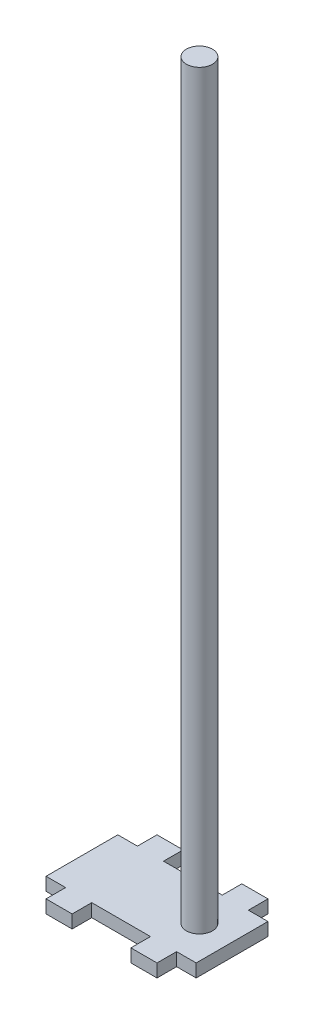
ISO-10303-21;
HEADER;
FILE_DESCRIPTION(('STEP AP214'),'2;1');
FILE_NAME('part.step','',(''),(''),'','','');
FILE_SCHEMA(('AUTOMOTIVE_DESIGN { 1 0 10303 214 1 1 1 1 }'));
ENDSEC;
DATA;
#1=APPLICATION_CONTEXT('core data for automotive mechanical design processes');
#2=APPLICATION_PROTOCOL_DEFINITION('international standard','automotive_design',2000,#1);
#3=PRODUCT_CONTEXT('',#1,'mechanical');
#4=PRODUCT('Part','Part','',(#3));
#5=PRODUCT_RELATED_PRODUCT_CATEGORY('part','',(#4));
#6=PRODUCT_DEFINITION_FORMATION('','',#4);
#7=PRODUCT_DEFINITION_CONTEXT('part definition',#1,'design');
#8=PRODUCT_DEFINITION('design','',#6,#7);
#9=PRODUCT_DEFINITION_SHAPE('','',#8);
#10=(LENGTH_UNIT() NAMED_UNIT(*) SI_UNIT(.MILLI.,.METRE.));
#11=(NAMED_UNIT(*) PLANE_ANGLE_UNIT() SI_UNIT($,.RADIAN.));
#12=(NAMED_UNIT(*) SI_UNIT($,.STERADIAN.) SOLID_ANGLE_UNIT());
#13=UNCERTAINTY_MEASURE_WITH_UNIT(LENGTH_MEASURE(1.E-05),#10,'distance_accuracy_value','');
#14=(GEOMETRIC_REPRESENTATION_CONTEXT(3) GLOBAL_UNCERTAINTY_ASSIGNED_CONTEXT((#13)) GLOBAL_UNIT_ASSIGNED_CONTEXT((#10,
#11,#12)) REPRESENTATION_CONTEXT('',''));
#15=CARTESIAN_POINT('',(0.,0.,0.));
#16=DIRECTION('',(0.,0.,1.));
#17=DIRECTION('',(1.,0.,0.));
#18=AXIS2_PLACEMENT_3D('',#15,#16,#17);
#19=CARTESIAN_POINT('',(-11.5,1.,-5.5));
#20=DIRECTION('',(0.,0.,1.));
#21=DIRECTION('',(1.,0.,0.));
#22=AXIS2_PLACEMENT_3D('',#19,#20,#21);
#23=PLANE('',#22);
#24=DIRECTION('',(0.,-1.,0.));
#25=VECTOR('',#24,1.);
#26=CARTESIAN_POINT('',(-4.5,1.,-5.5));
#27=LINE('',#26,#25);
#28=CARTESIAN_POINT('',(-4.5,1.,-5.5));
#29=VERTEX_POINT('',#28);
#30=CARTESIAN_POINT('',(-4.5,-1.,-5.5));
#31=VERTEX_POINT('',#30);
#32=EDGE_CURVE('E60',#29,#31,#27,.T.);
#33=ORIENTED_EDGE('',*,*,#32,.F.);
#34=DIRECTION('',(-1.,0.,0.));
#35=VECTOR('',#34,1.);
#36=CARTESIAN_POINT('',(-11.5,1.,-5.5));
#37=LINE('',#36,#35);
#38=CARTESIAN_POINT('',(4.5,1.,-5.5));
#39=VERTEX_POINT('',#38);
#40=EDGE_CURVE('E182',#39,#29,#37,.T.);
#41=ORIENTED_EDGE('',*,*,#40,.F.);
#42=DIRECTION('',(0.,-1.,0.));
#43=VECTOR('',#42,1.);
#44=CARTESIAN_POINT('',(4.5,1.,-5.5));
#45=LINE('',#44,#43);
#46=CARTESIAN_POINT('',(4.5,-1.,-5.5));
#47=VERTEX_POINT('',#46);
#48=EDGE_CURVE('E283',#39,#47,#45,.T.);
#49=ORIENTED_EDGE('',*,*,#48,.T.);
#50=DIRECTION('',(-1.,0.,0.));
#51=VECTOR('',#50,1.);
#52=CARTESIAN_POINT('',(-11.5,-1.,-5.5));
#53=LINE('',#52,#51);
#54=EDGE_CURVE('E312',#47,#31,#53,.T.);
#55=ORIENTED_EDGE('',*,*,#54,.T.);
#56=EDGE_LOOP('',(#33,#41,#49,#55));
#57=FACE_BOUND('',#56,.T.);
#58=ADVANCED_FACE('F37',(#57),#23,.F.);
#59=DIRECTION('',(0.,-1.,0.));
#60=VECTOR('',#59,1.);
#61=CARTESIAN_POINT('',(-8.5,1.,-5.5));
#62=LINE('',#61,#60);
#63=CARTESIAN_POINT('',(-8.5,1.,-5.5));
#64=VERTEX_POINT('',#63);
#65=CARTESIAN_POINT('',(-8.5,-1.,-5.5));
#66=VERTEX_POINT('',#65);
#67=EDGE_CURVE('E200',#64,#66,#62,.T.);
#68=ORIENTED_EDGE('',*,*,#67,.T.);
#69=CARTESIAN_POINT('',(-11.5,-1.,-5.5));
#70=VERTEX_POINT('',#69);
#71=EDGE_CURVE('E309',#66,#70,#53,.T.);
#72=ORIENTED_EDGE('',*,*,#71,.T.);
#73=DIRECTION('',(0.,-1.,0.));
#74=VECTOR('',#73,1.);
#75=CARTESIAN_POINT('',(-11.5,1.,-5.5));
#76=LINE('',#75,#74);
#77=CARTESIAN_POINT('',(-11.5,1.,-5.5));
#78=VERTEX_POINT('',#77);
#79=EDGE_CURVE('E300',#78,#70,#76,.T.);
#80=ORIENTED_EDGE('',*,*,#79,.F.);
#81=EDGE_CURVE('E52',#64,#78,#37,.T.);
#82=ORIENTED_EDGE('',*,*,#81,.F.);
#83=EDGE_LOOP('',(#68,#72,#80,#82));
#84=FACE_BOUND('',#83,.T.);
#85=ADVANCED_FACE('F369',(#84),#23,.F.);
#86=CARTESIAN_POINT('',(-11.5,1.,5.5));
#87=DIRECTION('',(0.,0.,-1.));
#88=DIRECTION('',(-1.,0.,0.));
#89=AXIS2_PLACEMENT_3D('',#86,#87,#88);
#90=PLANE('',#89);
#91=DIRECTION('',(0.,-1.,0.));
#92=VECTOR('',#91,1.);
#93=CARTESIAN_POINT('',(-4.5,1.,5.5));
#94=LINE('',#93,#92);
#95=CARTESIAN_POINT('',(-4.5,1.,5.5));
#96=VERTEX_POINT('',#95);
#97=CARTESIAN_POINT('',(-4.5,-1.,5.5));
#98=VERTEX_POINT('',#97);
#99=EDGE_CURVE('E236',#96,#98,#94,.T.);
#100=ORIENTED_EDGE('',*,*,#99,.T.);
#101=DIRECTION('',(1.,0.,0.));
#102=VECTOR('',#101,1.);
#103=CARTESIAN_POINT('',(-11.5,-1.,5.5));
#104=LINE('',#103,#102);
#105=CARTESIAN_POINT('',(4.5,-1.,5.5));
#106=VERTEX_POINT('',#105);
#107=EDGE_CURVE('E307',#98,#106,#104,.T.);
#108=ORIENTED_EDGE('',*,*,#107,.T.);
#109=DIRECTION('',(0.,-1.,0.));
#110=VECTOR('',#109,1.);
#111=CARTESIAN_POINT('',(4.5,1.,5.5));
#112=LINE('',#111,#110);
#113=CARTESIAN_POINT('',(4.5,1.,5.5));
#114=VERTEX_POINT('',#113);
#115=EDGE_CURVE('E260',#114,#106,#112,.T.);
#116=ORIENTED_EDGE('',*,*,#115,.F.);
#117=DIRECTION('',(1.,0.,0.));
#118=VECTOR('',#117,1.);
#119=CARTESIAN_POINT('',(-11.5,1.,5.5));
#120=LINE('',#119,#118);
#121=EDGE_CURVE('E295',#96,#114,#120,.T.);
#122=ORIENTED_EDGE('',*,*,#121,.F.);
#123=EDGE_LOOP('',(#100,#108,#116,#122));
#124=FACE_BOUND('',#123,.T.);
#125=ADVANCED_FACE('F350',(#124),#90,.F.);
#126=DIRECTION('',(0.,-1.,0.));
#127=VECTOR('',#126,1.);
#128=CARTESIAN_POINT('',(-8.5,1.,5.5));
#129=LINE('',#128,#127);
#130=CARTESIAN_POINT('',(-8.5,1.,5.5));
#131=VERTEX_POINT('',#130);
#132=CARTESIAN_POINT('',(-8.5,-1.,5.5));
#133=VERTEX_POINT('',#132);
#134=EDGE_CURVE('E233',#131,#133,#129,.T.);
#135=ORIENTED_EDGE('',*,*,#134,.F.);
#136=CARTESIAN_POINT('',(-11.5,1.,5.5));
#137=VERTEX_POINT('',#136);
#138=EDGE_CURVE('E291',#137,#131,#120,.T.);
#139=ORIENTED_EDGE('',*,*,#138,.F.);
#140=DIRECTION('',(0.,-1.,0.));
#141=VECTOR('',#140,1.);
#142=CARTESIAN_POINT('',(-11.5,1.,5.5));
#143=LINE('',#142,#141);
#144=CARTESIAN_POINT('',(-11.5,-1.,5.5));
#145=VERTEX_POINT('',#144);
#146=EDGE_CURVE('E11',#137,#145,#143,.T.);
#147=ORIENTED_EDGE('',*,*,#146,.T.);
#148=EDGE_CURVE('E304',#145,#133,#104,.T.);
#149=ORIENTED_EDGE('',*,*,#148,.T.);
#150=EDGE_LOOP('',(#135,#139,#147,#149));
#151=FACE_BOUND('',#150,.T.);
#152=ADVANCED_FACE('F361',(#151),#90,.F.);
#153=DIRECTION('',(0.,-1.,0.));
#154=VECTOR('',#153,1.);
#155=CARTESIAN_POINT('',(8.5,1.,-5.5));
#156=LINE('',#155,#154);
#157=CARTESIAN_POINT('',(8.5,1.,-5.5));
#158=VERTEX_POINT('',#157);
#159=CARTESIAN_POINT('',(8.5,-1.,-5.5));
#160=VERTEX_POINT('',#159);
#161=EDGE_CURVE('E281',#158,#160,#156,.T.);
#162=ORIENTED_EDGE('',*,*,#161,.F.);
#163=CARTESIAN_POINT('',(11.5,1.,-5.5));
#164=VERTEX_POINT('',#163);
#165=EDGE_CURVE('E297',#164,#158,#37,.T.);
#166=ORIENTED_EDGE('',*,*,#165,.F.);
#167=DIRECTION('',(0.,-1.,0.));
#168=VECTOR('',#167,1.);
#169=CARTESIAN_POINT('',(11.5,1.,-5.5));
#170=LINE('',#169,#168);
#171=CARTESIAN_POINT('',(11.5,-1.,-5.5));
#172=VERTEX_POINT('',#171);
#173=EDGE_CURVE('E315',#164,#172,#170,.T.);
#174=ORIENTED_EDGE('',*,*,#173,.T.);
#175=EDGE_CURVE('E290',#172,#160,#53,.T.);
#176=ORIENTED_EDGE('',*,*,#175,.T.);
#177=EDGE_LOOP('',(#162,#166,#174,#176));
#178=FACE_BOUND('',#177,.T.);
#179=ADVANCED_FACE('F336',(#178),#23,.F.);
#180=CARTESIAN_POINT('',(-11.5,1.,-5.5));
#181=DIRECTION('',(1.,0.,0.));
#182=DIRECTION('',(0.,0.,-1.));
#183=AXIS2_PLACEMENT_3D('',#180,#181,#182);
#184=PLANE('',#183);
#185=DIRECTION('',(0.,0.,1.));
#186=VECTOR('',#185,1.);
#187=CARTESIAN_POINT('',(-11.5,-1.,-5.5));
#188=LINE('',#187,#186);
#189=EDGE_CURVE('E286',#70,#145,#188,.T.);
#190=ORIENTED_EDGE('',*,*,#189,.T.);
#191=ORIENTED_EDGE('',*,*,#146,.F.);
#192=DIRECTION('',(0.,0.,1.));
#193=VECTOR('',#192,1.);
#194=CARTESIAN_POINT('',(-11.5,1.,-5.5));
#195=LINE('',#194,#193);
#196=EDGE_CURVE('E287',#78,#137,#195,.T.);
#197=ORIENTED_EDGE('',*,*,#196,.F.);
#198=ORIENTED_EDGE('',*,*,#79,.T.);
#199=EDGE_LOOP('',(#190,#191,#197,#198));
#200=FACE_BOUND('',#199,.T.);
#201=ADVANCED_FACE('F39',(#200),#184,.F.);
#202=CARTESIAN_POINT('',(8.5,1.,5.5));
#203=VERTEX_POINT('',#202);
#204=CARTESIAN_POINT('',(11.5,1.,5.5));
#205=VERTEX_POINT('',#204);
#206=EDGE_CURVE('E289',#203,#205,#120,.T.);
#207=ORIENTED_EDGE('',*,*,#206,.F.);
#208=DIRECTION('',(0.,-1.,0.));
#209=VECTOR('',#208,1.);
#210=CARTESIAN_POINT('',(8.5,1.,5.5));
#211=LINE('',#210,#209);
#212=CARTESIAN_POINT('',(8.5,-1.,5.5));
#213=VERTEX_POINT('',#212);
#214=EDGE_CURVE('E247',#203,#213,#211,.T.);
#215=ORIENTED_EDGE('',*,*,#214,.T.);
#216=CARTESIAN_POINT('',(11.5,-1.,5.5));
#217=VERTEX_POINT('',#216);
#218=EDGE_CURVE('E303',#213,#217,#104,.T.);
#219=ORIENTED_EDGE('',*,*,#218,.T.);
#220=DIRECTION('',(0.,-1.,0.));
#221=VECTOR('',#220,1.);
#222=CARTESIAN_POINT('',(11.5,1.,5.5));
#223=LINE('',#222,#221);
#224=EDGE_CURVE('E45',#205,#217,#223,.T.);
#225=ORIENTED_EDGE('',*,*,#224,.F.);
#226=EDGE_LOOP('',(#207,#215,#219,#225));
#227=FACE_BOUND('',#226,.T.);
#228=ADVANCED_FACE('F359',(#227),#90,.F.);
#229=CARTESIAN_POINT('',(11.5,1.,-5.5));
#230=DIRECTION('',(-1.,0.,0.));
#231=DIRECTION('',(0.,0.,1.));
#232=AXIS2_PLACEMENT_3D('',#229,#230,#231);
#233=PLANE('',#232);
#234=DIRECTION('',(0.,0.,-1.));
#235=VECTOR('',#234,1.);
#236=CARTESIAN_POINT('',(11.5,-1.,-5.5));
#237=LINE('',#236,#235);
#238=EDGE_CURVE('E306',#217,#172,#237,.T.);
#239=ORIENTED_EDGE('',*,*,#238,.T.);
#240=ORIENTED_EDGE('',*,*,#173,.F.);
#241=DIRECTION('',(0.,0.,-1.));
#242=VECTOR('',#241,1.);
#243=CARTESIAN_POINT('',(11.5,1.,-5.5));
#244=LINE('',#243,#242);
#245=EDGE_CURVE('E294',#205,#164,#244,.T.);
#246=ORIENTED_EDGE('',*,*,#245,.F.);
#247=ORIENTED_EDGE('',*,*,#224,.T.);
#248=EDGE_LOOP('',(#239,#240,#246,#247));
#249=FACE_BOUND('',#248,.T.);
#250=ADVANCED_FACE('F322',(#249),#233,.F.);
#251=CARTESIAN_POINT('',(0.,1.,0.));
#252=DIRECTION('',(0.,1.,0.));
#253=DIRECTION('',(0.,0.,1.));
#254=AXIS2_PLACEMENT_3D('',#251,#252,#253);
#255=PLANE('',#254);
#256=CARTESIAN_POINT('',(6.5,1.,0.));
#257=DIRECTION('',(0.,1.,0.));
#258=DIRECTION('',(0.,0.,1.));
#259=AXIS2_PLACEMENT_3D('',#256,#257,#258);
#260=CIRCLE('',#259,2.);
#261=CARTESIAN_POINT('',(6.5,1.,2.));
#262=VERTEX_POINT('',#261);
#263=EDGE_CURVE('E611',#262,#262,#260,.T.);
#264=ORIENTED_EDGE('',*,*,#263,.F.);
#265=EDGE_LOOP('',(#264));
#266=FACE_BOUND('',#265,.T.);
#267=ORIENTED_EDGE('',*,*,#196,.T.);
#268=ORIENTED_EDGE('',*,*,#138,.T.);
#269=DIRECTION('',(0.,0.,1.));
#270=VECTOR('',#269,1.);
#271=CARTESIAN_POINT('',(-8.5,1.,5.5));
#272=LINE('',#271,#270);
#273=CARTESIAN_POINT('',(-8.5,1.,8.5));
#274=VERTEX_POINT('',#273);
#275=EDGE_CURVE('E217',#131,#274,#272,.T.);
#276=ORIENTED_EDGE('',*,*,#275,.T.);
#277=DIRECTION('',(1.,0.,0.));
#278=VECTOR('',#277,1.);
#279=CARTESIAN_POINT('',(-4.5,1.,8.5));
#280=LINE('',#279,#278);
#281=CARTESIAN_POINT('',(-4.5,1.,8.5));
#282=VERTEX_POINT('',#281);
#283=EDGE_CURVE('E220',#274,#282,#280,.T.);
#284=ORIENTED_EDGE('',*,*,#283,.T.);
#285=DIRECTION('',(0.,0.,-1.));
#286=VECTOR('',#285,1.);
#287=CARTESIAN_POINT('',(-4.5,1.,5.5));
#288=LINE('',#287,#286);
#289=EDGE_CURVE('E214',#282,#96,#288,.T.);
#290=ORIENTED_EDGE('',*,*,#289,.T.);
#291=ORIENTED_EDGE('',*,*,#121,.T.);
#292=DIRECTION('',(0.,0.,1.));
#293=VECTOR('',#292,1.);
#294=CARTESIAN_POINT('',(4.5,1.,5.5));
#295=LINE('',#294,#293);
#296=CARTESIAN_POINT('',(4.5,1.,8.5));
#297=VERTEX_POINT('',#296);
#298=EDGE_CURVE('E240',#114,#297,#295,.T.);
#299=ORIENTED_EDGE('',*,*,#298,.T.);
#300=DIRECTION('',(1.,0.,0.));
#301=VECTOR('',#300,1.);
#302=CARTESIAN_POINT('',(4.5,1.,8.5));
#303=LINE('',#302,#301);
#304=CARTESIAN_POINT('',(8.5,1.,8.5));
#305=VERTEX_POINT('',#304);
#306=EDGE_CURVE('E242',#297,#305,#303,.T.);
#307=ORIENTED_EDGE('',*,*,#306,.T.);
#308=DIRECTION('',(0.,0.,-1.));
#309=VECTOR('',#308,1.);
#310=CARTESIAN_POINT('',(8.5,1.,5.5));
#311=LINE('',#310,#309);
#312=EDGE_CURVE('E245',#305,#203,#311,.T.);
#313=ORIENTED_EDGE('',*,*,#312,.T.);
#314=ORIENTED_EDGE('',*,*,#206,.T.);
#315=ORIENTED_EDGE('',*,*,#245,.T.);
#316=ORIENTED_EDGE('',*,*,#165,.T.);
#317=DIRECTION('',(0.,0.,-1.));
#318=VECTOR('',#317,1.);
#319=CARTESIAN_POINT('',(8.5,1.,-5.5));
#320=LINE('',#319,#318);
#321=CARTESIAN_POINT('',(8.5,1.,-8.5));
#322=VERTEX_POINT('',#321);
#323=EDGE_CURVE('E266',#158,#322,#320,.T.);
#324=ORIENTED_EDGE('',*,*,#323,.T.);
#325=DIRECTION('',(-1.,0.,0.));
#326=VECTOR('',#325,1.);
#327=CARTESIAN_POINT('',(4.5,1.,-8.5));
#328=LINE('',#327,#326);
#329=CARTESIAN_POINT('',(4.5,1.,-8.5));
#330=VERTEX_POINT('',#329);
#331=EDGE_CURVE('E269',#322,#330,#328,.T.);
#332=ORIENTED_EDGE('',*,*,#331,.T.);
#333=DIRECTION('',(0.,0.,1.));
#334=VECTOR('',#333,1.);
#335=CARTESIAN_POINT('',(4.5,1.,-5.5));
#336=LINE('',#335,#334);
#337=EDGE_CURVE('E264',#330,#39,#336,.T.);
#338=ORIENTED_EDGE('',*,*,#337,.T.);
#339=ORIENTED_EDGE('',*,*,#40,.T.);
#340=DIRECTION('',(0.,0.,-1.));
#341=VECTOR('',#340,1.);
#342=CARTESIAN_POINT('',(-4.5,1.,-5.5));
#343=LINE('',#342,#341);
#344=CARTESIAN_POINT('',(-4.5,1.,-8.5));
#345=VERTEX_POINT('',#344);
#346=EDGE_CURVE('E175',#29,#345,#343,.T.);
#347=ORIENTED_EDGE('',*,*,#346,.T.);
#348=DIRECTION('',(-1.,0.,0.));
#349=VECTOR('',#348,1.);
#350=CARTESIAN_POINT('',(-4.5,1.,-8.5));
#351=LINE('',#350,#349);
#352=CARTESIAN_POINT('',(-8.5,1.,-8.5));
#353=VERTEX_POINT('',#352);
#354=EDGE_CURVE('E180',#345,#353,#351,.T.);
#355=ORIENTED_EDGE('',*,*,#354,.T.);
#356=DIRECTION('',(0.,0.,1.));
#357=VECTOR('',#356,1.);
#358=CARTESIAN_POINT('',(-8.5,1.,-5.5));
#359=LINE('',#358,#357);
#360=EDGE_CURVE('E198',#353,#64,#359,.T.);
#361=ORIENTED_EDGE('',*,*,#360,.T.);
#362=ORIENTED_EDGE('',*,*,#81,.T.);
#363=EDGE_LOOP('',(#267,#268,#276,#284,#290,#291,#299,#307,#313,#314,#315,#316,#324,#332,#338,
#339,#347,#355,#361,#362));
#364=FACE_BOUND('',#363,.T.);
#365=ADVANCED_FACE('F178',(#266,#364),#255,.T.);
#366=CARTESIAN_POINT('',(0.,-1.,0.));
#367=DIRECTION('',(0.,1.,0.));
#368=DIRECTION('',(0.,0.,1.));
#369=AXIS2_PLACEMENT_3D('',#366,#367,#368);
#370=PLANE('',#369);
#371=ORIENTED_EDGE('',*,*,#189,.F.);
#372=ORIENTED_EDGE('',*,*,#71,.F.);
#373=DIRECTION('',(0.,0.,1.));
#374=VECTOR('',#373,1.);
#375=CARTESIAN_POINT('',(-8.5,-1.,-5.5));
#376=LINE('',#375,#374);
#377=CARTESIAN_POINT('',(-8.5,-1.,-8.5));
#378=VERTEX_POINT('',#377);
#379=EDGE_CURVE('E184',#378,#66,#376,.T.);
#380=ORIENTED_EDGE('',*,*,#379,.F.);
#381=DIRECTION('',(-1.,0.,0.));
#382=VECTOR('',#381,1.);
#383=CARTESIAN_POINT('',(-4.5,-1.,-8.5));
#384=LINE('',#383,#382);
#385=CARTESIAN_POINT('',(-4.5,-1.,-8.5));
#386=VERTEX_POINT('',#385);
#387=EDGE_CURVE('E205',#386,#378,#384,.T.);
#388=ORIENTED_EDGE('',*,*,#387,.F.);
#389=DIRECTION('',(0.,0.,-1.));
#390=VECTOR('',#389,1.);
#391=CARTESIAN_POINT('',(-4.5,-1.,-5.5));
#392=LINE('',#391,#390);
#393=EDGE_CURVE('E190',#31,#386,#392,.T.);
#394=ORIENTED_EDGE('',*,*,#393,.F.);
#395=ORIENTED_EDGE('',*,*,#54,.F.);
#396=DIRECTION('',(0.,0.,1.));
#397=VECTOR('',#396,1.);
#398=CARTESIAN_POINT('',(4.5,-1.,-5.5));
#399=LINE('',#398,#397);
#400=CARTESIAN_POINT('',(4.5,-1.,-8.5));
#401=VERTEX_POINT('',#400);
#402=EDGE_CURVE('E263',#401,#47,#399,.T.);
#403=ORIENTED_EDGE('',*,*,#402,.F.);
#404=DIRECTION('',(-1.,0.,0.));
#405=VECTOR('',#404,1.);
#406=CARTESIAN_POINT('',(4.5,-1.,-8.5));
#407=LINE('',#406,#405);
#408=CARTESIAN_POINT('',(8.5,-1.,-8.5));
#409=VERTEX_POINT('',#408);
#410=EDGE_CURVE('E267',#409,#401,#407,.T.);
#411=ORIENTED_EDGE('',*,*,#410,.F.);
#412=DIRECTION('',(0.,0.,-1.));
#413=VECTOR('',#412,1.);
#414=CARTESIAN_POINT('',(8.5,-1.,-5.5));
#415=LINE('',#414,#413);
#416=EDGE_CURVE('E273',#160,#409,#415,.T.);
#417=ORIENTED_EDGE('',*,*,#416,.F.);
#418=ORIENTED_EDGE('',*,*,#175,.F.);
#419=ORIENTED_EDGE('',*,*,#238,.F.);
#420=ORIENTED_EDGE('',*,*,#218,.F.);
#421=DIRECTION('',(0.,0.,-1.));
#422=VECTOR('',#421,1.);
#423=CARTESIAN_POINT('',(8.5,-1.,5.5));
#424=LINE('',#423,#422);
#425=CARTESIAN_POINT('',(8.5,-1.,8.5));
#426=VERTEX_POINT('',#425);
#427=EDGE_CURVE('E243',#426,#213,#424,.T.);
#428=ORIENTED_EDGE('',*,*,#427,.F.);
#429=DIRECTION('',(1.,0.,0.));
#430=VECTOR('',#429,1.);
#431=CARTESIAN_POINT('',(4.5,-1.,8.5));
#432=LINE('',#431,#430);
#433=CARTESIAN_POINT('',(4.5,-1.,8.5));
#434=VERTEX_POINT('',#433);
#435=EDGE_CURVE('E249',#434,#426,#432,.T.);
#436=ORIENTED_EDGE('',*,*,#435,.F.);
#437=DIRECTION('',(0.,0.,1.));
#438=VECTOR('',#437,1.);
#439=CARTESIAN_POINT('',(4.5,-1.,5.5));
#440=LINE('',#439,#438);
#441=EDGE_CURVE('E239',#106,#434,#440,.T.);
#442=ORIENTED_EDGE('',*,*,#441,.F.);
#443=ORIENTED_EDGE('',*,*,#107,.F.);
#444=DIRECTION('',(0.,0.,-1.));
#445=VECTOR('',#444,1.);
#446=CARTESIAN_POINT('',(-4.5,-1.,5.5));
#447=LINE('',#446,#445);
#448=CARTESIAN_POINT('',(-4.5,-1.,8.5));
#449=VERTEX_POINT('',#448);
#450=EDGE_CURVE('E213',#449,#98,#447,.T.);
#451=ORIENTED_EDGE('',*,*,#450,.F.);
#452=DIRECTION('',(1.,0.,0.));
#453=VECTOR('',#452,1.);
#454=CARTESIAN_POINT('',(-4.5,-1.,8.5));
#455=LINE('',#454,#453);
#456=CARTESIAN_POINT('',(-8.5,-1.,8.5));
#457=VERTEX_POINT('',#456);
#458=EDGE_CURVE('E218',#457,#449,#455,.T.);
#459=ORIENTED_EDGE('',*,*,#458,.F.);
#460=DIRECTION('',(0.,0.,1.));
#461=VECTOR('',#460,1.);
#462=CARTESIAN_POINT('',(-8.5,-1.,5.5));
#463=LINE('',#462,#461);
#464=EDGE_CURVE('E225',#133,#457,#463,.T.);
#465=ORIENTED_EDGE('',*,*,#464,.F.);
#466=ORIENTED_EDGE('',*,*,#148,.F.);
#467=EDGE_LOOP('',(#371,#372,#380,#388,#394,#395,#403,#411,#417,#418,#419,#420,#428,#436,#442,
#443,#451,#459,#465,#466));
#468=FACE_BOUND('',#467,.T.);
#469=ADVANCED_FACE('F330',(#468),#370,.F.);
#470=CARTESIAN_POINT('',(4.5,1.,-5.5));
#471=DIRECTION('',(1.,0.,0.));
#472=DIRECTION('',(0.,0.,-1.));
#473=AXIS2_PLACEMENT_3D('',#470,#471,#472);
#474=PLANE('',#473);
#475=ORIENTED_EDGE('',*,*,#402,.T.);
#476=ORIENTED_EDGE('',*,*,#48,.F.);
#477=ORIENTED_EDGE('',*,*,#337,.F.);
#478=DIRECTION('',(0.,-1.,0.));
#479=VECTOR('',#478,1.);
#480=CARTESIAN_POINT('',(4.5,1.,-8.5));
#481=LINE('',#480,#479);
#482=EDGE_CURVE('E271',#330,#401,#481,.T.);
#483=ORIENTED_EDGE('',*,*,#482,.T.);
#484=EDGE_LOOP('',(#475,#476,#477,#483));
#485=FACE_BOUND('',#484,.T.);
#486=ADVANCED_FACE('F428',(#485),#474,.F.);
#487=CARTESIAN_POINT('',(8.5,1.,-5.5));
#488=DIRECTION('',(-1.,0.,0.));
#489=DIRECTION('',(0.,0.,1.));
#490=AXIS2_PLACEMENT_3D('',#487,#488,#489);
#491=PLANE('',#490);
#492=ORIENTED_EDGE('',*,*,#416,.T.);
#493=DIRECTION('',(0.,-1.,0.));
#494=VECTOR('',#493,1.);
#495=CARTESIAN_POINT('',(8.5,1.,-8.5));
#496=LINE('',#495,#494);
#497=EDGE_CURVE('E278',#322,#409,#496,.T.);
#498=ORIENTED_EDGE('',*,*,#497,.F.);
#499=ORIENTED_EDGE('',*,*,#323,.F.);
#500=ORIENTED_EDGE('',*,*,#161,.T.);
#501=EDGE_LOOP('',(#492,#498,#499,#500));
#502=FACE_BOUND('',#501,.T.);
#503=ADVANCED_FACE('F505',(#502),#491,.F.);
#504=CARTESIAN_POINT('',(4.5,1.,-8.5));
#505=DIRECTION('',(0.,0.,1.));
#506=DIRECTION('',(1.,0.,0.));
#507=AXIS2_PLACEMENT_3D('',#504,#505,#506);
#508=PLANE('',#507);
#509=ORIENTED_EDGE('',*,*,#410,.T.);
#510=ORIENTED_EDGE('',*,*,#482,.F.);
#511=ORIENTED_EDGE('',*,*,#331,.F.);
#512=ORIENTED_EDGE('',*,*,#497,.T.);
#513=EDGE_LOOP('',(#509,#510,#511,#512));
#514=FACE_BOUND('',#513,.T.);
#515=ADVANCED_FACE('F502',(#514),#508,.F.);
#516=CARTESIAN_POINT('',(4.5,1.,5.5));
#517=DIRECTION('',(1.,0.,0.));
#518=DIRECTION('',(0.,0.,-1.));
#519=AXIS2_PLACEMENT_3D('',#516,#517,#518);
#520=PLANE('',#519);
#521=ORIENTED_EDGE('',*,*,#441,.T.);
#522=DIRECTION('',(0.,-1.,0.));
#523=VECTOR('',#522,1.);
#524=CARTESIAN_POINT('',(4.5,1.,8.5));
#525=LINE('',#524,#523);
#526=EDGE_CURVE('E257',#297,#434,#525,.T.);
#527=ORIENTED_EDGE('',*,*,#526,.F.);
#528=ORIENTED_EDGE('',*,*,#298,.F.);
#529=ORIENTED_EDGE('',*,*,#115,.T.);
#530=EDGE_LOOP('',(#521,#527,#528,#529));
#531=FACE_BOUND('',#530,.T.);
#532=ADVANCED_FACE('F348',(#531),#520,.F.);
#533=CARTESIAN_POINT('',(4.5,1.,8.5));
#534=DIRECTION('',(0.,0.,-1.));
#535=DIRECTION('',(-1.,0.,0.));
#536=AXIS2_PLACEMENT_3D('',#533,#534,#535);
#537=PLANE('',#536);
#538=ORIENTED_EDGE('',*,*,#435,.T.);
#539=DIRECTION('',(0.,-1.,0.));
#540=VECTOR('',#539,1.);
#541=CARTESIAN_POINT('',(8.5,1.,8.5));
#542=LINE('',#541,#540);
#543=EDGE_CURVE('E254',#305,#426,#542,.T.);
#544=ORIENTED_EDGE('',*,*,#543,.F.);
#545=ORIENTED_EDGE('',*,*,#306,.F.);
#546=ORIENTED_EDGE('',*,*,#526,.T.);
#547=EDGE_LOOP('',(#538,#544,#545,#546));
#548=FACE_BOUND('',#547,.T.);
#549=ADVANCED_FACE('F355',(#548),#537,.F.);
#550=CARTESIAN_POINT('',(8.5,1.,5.5));
#551=DIRECTION('',(-1.,0.,0.));
#552=DIRECTION('',(0.,0.,1.));
#553=AXIS2_PLACEMENT_3D('',#550,#551,#552);
#554=PLANE('',#553);
#555=ORIENTED_EDGE('',*,*,#427,.T.);
#556=ORIENTED_EDGE('',*,*,#214,.F.);
#557=ORIENTED_EDGE('',*,*,#312,.F.);
#558=ORIENTED_EDGE('',*,*,#543,.T.);
#559=EDGE_LOOP('',(#555,#556,#557,#558));
#560=FACE_BOUND('',#559,.T.);
#561=ADVANCED_FACE('F358',(#560),#554,.F.);
#562=CARTESIAN_POINT('',(-4.5,1.,5.5));
#563=DIRECTION('',(-1.,0.,0.));
#564=DIRECTION('',(0.,0.,1.));
#565=AXIS2_PLACEMENT_3D('',#562,#563,#564);
#566=PLANE('',#565);
#567=ORIENTED_EDGE('',*,*,#450,.T.);
#568=ORIENTED_EDGE('',*,*,#99,.F.);
#569=ORIENTED_EDGE('',*,*,#289,.F.);
#570=DIRECTION('',(0.,-1.,0.));
#571=VECTOR('',#570,1.);
#572=CARTESIAN_POINT('',(-4.5,1.,8.5));
#573=LINE('',#572,#571);
#574=EDGE_CURVE('E222',#282,#449,#573,.T.);
#575=ORIENTED_EDGE('',*,*,#574,.T.);
#576=EDGE_LOOP('',(#567,#568,#569,#575));
#577=FACE_BOUND('',#576,.T.);
#578=ADVANCED_FACE('F491',(#577),#566,.F.);
#579=CARTESIAN_POINT('',(-8.5,1.,5.5));
#580=DIRECTION('',(1.,0.,0.));
#581=DIRECTION('',(0.,0.,-1.));
#582=AXIS2_PLACEMENT_3D('',#579,#580,#581);
#583=PLANE('',#582);
#584=ORIENTED_EDGE('',*,*,#464,.T.);
#585=DIRECTION('',(0.,-1.,0.));
#586=VECTOR('',#585,1.);
#587=CARTESIAN_POINT('',(-8.5,1.,8.5));
#588=LINE('',#587,#586);
#589=EDGE_CURVE('E230',#274,#457,#588,.T.);
#590=ORIENTED_EDGE('',*,*,#589,.F.);
#591=ORIENTED_EDGE('',*,*,#275,.F.);
#592=ORIENTED_EDGE('',*,*,#134,.T.);
#593=EDGE_LOOP('',(#584,#590,#591,#592));
#594=FACE_BOUND('',#593,.T.);
#595=ADVANCED_FACE('F487',(#594),#583,.F.);
#596=CARTESIAN_POINT('',(-4.5,1.,8.5));
#597=DIRECTION('',(0.,0.,-1.));
#598=DIRECTION('',(-1.,0.,0.));
#599=AXIS2_PLACEMENT_3D('',#596,#597,#598);
#600=PLANE('',#599);
#601=ORIENTED_EDGE('',*,*,#458,.T.);
#602=ORIENTED_EDGE('',*,*,#574,.F.);
#603=ORIENTED_EDGE('',*,*,#283,.F.);
#604=ORIENTED_EDGE('',*,*,#589,.T.);
#605=EDGE_LOOP('',(#601,#602,#603,#604));
#606=FACE_BOUND('',#605,.T.);
#607=ADVANCED_FACE('F484',(#606),#600,.F.);
#608=CARTESIAN_POINT('',(-4.5,1.,-5.5));
#609=DIRECTION('',(-1.,0.,0.));
#610=DIRECTION('',(0.,0.,1.));
#611=AXIS2_PLACEMENT_3D('',#608,#609,#610);
#612=PLANE('',#611);
#613=ORIENTED_EDGE('',*,*,#393,.T.);
#614=DIRECTION('',(0.,-1.,0.));
#615=VECTOR('',#614,1.);
#616=CARTESIAN_POINT('',(-4.5,1.,-8.5));
#617=LINE('',#616,#615);
#618=EDGE_CURVE('E187',#345,#386,#617,.T.);
#619=ORIENTED_EDGE('',*,*,#618,.F.);
#620=ORIENTED_EDGE('',*,*,#346,.F.);
#621=ORIENTED_EDGE('',*,*,#32,.T.);
#622=EDGE_LOOP('',(#613,#619,#620,#621));
#623=FACE_BOUND('',#622,.T.);
#624=ADVANCED_FACE('F188',(#623),#612,.F.);
#625=CARTESIAN_POINT('',(-4.5,1.,-8.5));
#626=DIRECTION('',(0.,0.,1.));
#627=DIRECTION('',(1.,0.,0.));
#628=AXIS2_PLACEMENT_3D('',#625,#626,#627);
#629=PLANE('',#628);
#630=ORIENTED_EDGE('',*,*,#387,.T.);
#631=DIRECTION('',(0.,-1.,0.));
#632=VECTOR('',#631,1.);
#633=CARTESIAN_POINT('',(-8.5,1.,-8.5));
#634=LINE('',#633,#632);
#635=EDGE_CURVE('E193',#353,#378,#634,.T.);
#636=ORIENTED_EDGE('',*,*,#635,.F.);
#637=ORIENTED_EDGE('',*,*,#354,.F.);
#638=ORIENTED_EDGE('',*,*,#618,.T.);
#639=EDGE_LOOP('',(#630,#636,#637,#638));
#640=FACE_BOUND('',#639,.T.);
#641=ADVANCED_FACE('F195',(#640),#629,.F.);
#642=CARTESIAN_POINT('',(-8.5,1.,-5.5));
#643=DIRECTION('',(1.,0.,0.));
#644=DIRECTION('',(0.,0.,-1.));
#645=AXIS2_PLACEMENT_3D('',#642,#643,#644);
#646=PLANE('',#645);
#647=ORIENTED_EDGE('',*,*,#379,.T.);
#648=ORIENTED_EDGE('',*,*,#67,.F.);
#649=ORIENTED_EDGE('',*,*,#360,.F.);
#650=ORIENTED_EDGE('',*,*,#635,.T.);
#651=EDGE_LOOP('',(#647,#648,#649,#650));
#652=FACE_BOUND('',#651,.T.);
#653=ADVANCED_FACE('F452',(#652),#646,.F.);
#654=CARTESIAN_POINT('',(6.5,116.,0.));
#655=DIRECTION('',(0.,-1.,0.));
#656=DIRECTION('',(0.,0.,-1.));
#657=AXIS2_PLACEMENT_3D('',#654,#655,#656);
#658=CYLINDRICAL_SURFACE('',#657,2.);
#659=CARTESIAN_POINT('',(6.5,116.,0.));
#660=DIRECTION('',(0.,1.,0.));
#661=DIRECTION('',(0.,0.,1.));
#662=AXIS2_PLACEMENT_3D('',#659,#660,#661);
#663=CIRCLE('',#662,2.);
#664=CARTESIAN_POINT('',(6.5,116.,2.));
#665=VERTEX_POINT('',#664);
#666=EDGE_CURVE('E206',#665,#665,#663,.T.);
#667=ORIENTED_EDGE('',*,*,#666,.F.);
#668=EDGE_LOOP('',(#667));
#669=FACE_BOUND('',#668,.T.);
#670=ORIENTED_EDGE('',*,*,#263,.T.);
#671=EDGE_LOOP('',(#670));
#672=FACE_BOUND('',#671,.T.);
#673=ADVANCED_FACE('F457',(#669,#672),#658,.T.);
#674=CARTESIAN_POINT('',(6.5,116.,0.));
#675=DIRECTION('',(0.,1.,0.));
#676=DIRECTION('',(0.,0.,1.));
#677=AXIS2_PLACEMENT_3D('',#674,#675,#676);
#678=PLANE('',#677);
#679=ORIENTED_EDGE('',*,*,#666,.T.);
#680=EDGE_LOOP('',(#679));
#681=FACE_BOUND('',#680,.T.);
#682=ADVANCED_FACE('F462',(#681),#678,.T.);
#683=CLOSED_SHELL('',(#58,#85,#125,#152,#179,#201,#228,#250,#365,#469,#486,#503,#515,#532,#549,
#561,#578,#595,#607,#624,#641,#653,#673,#682));
#684=MANIFOLD_SOLID_BREP('B2',#683);
#685=ADVANCED_BREP_SHAPE_REPRESENTATION('',(#18,#684),#14);
#686=SHAPE_DEFINITION_REPRESENTATION(#9,#685);
ENDSEC;
END-ISO-10303-21;
